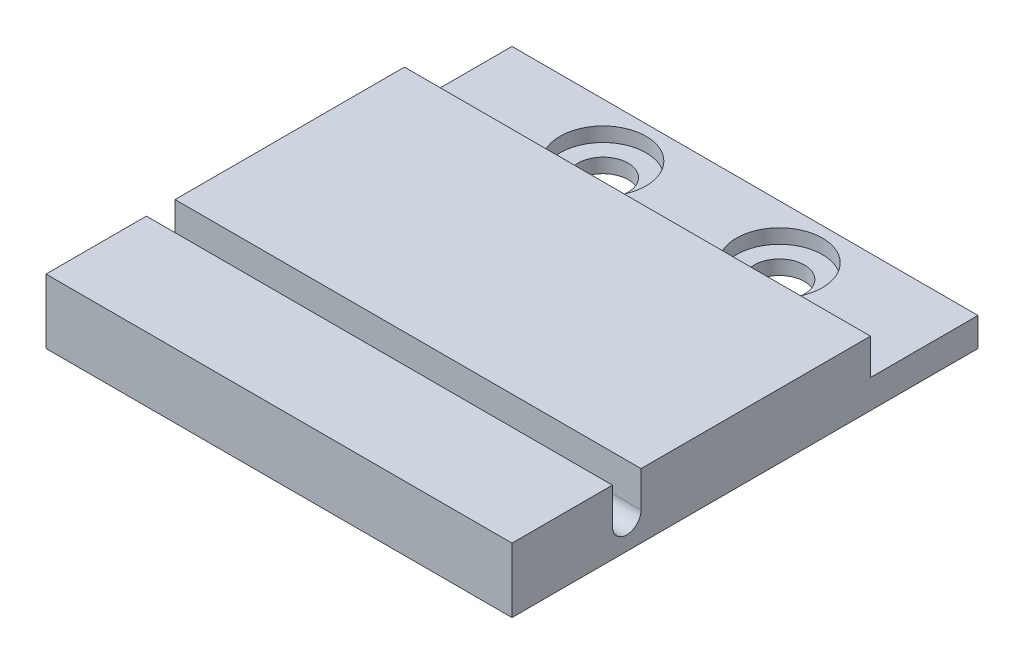
ISO-10303-21;
HEADER;
FILE_DESCRIPTION(('STEP AP214'),'2;1');
FILE_NAME('part.step','',(''),(''),'','','');
FILE_SCHEMA(('AUTOMOTIVE_DESIGN { 1 0 10303 214 1 1 1 1 }'));
ENDSEC;
DATA;
#1=APPLICATION_CONTEXT('core data for automotive mechanical design processes');
#2=APPLICATION_PROTOCOL_DEFINITION('international standard','automotive_design',2000,#1);
#3=PRODUCT_CONTEXT('',#1,'mechanical');
#4=PRODUCT('Part','Part','',(#3));
#5=PRODUCT_RELATED_PRODUCT_CATEGORY('part','',(#4));
#6=PRODUCT_DEFINITION_FORMATION('','',#4);
#7=PRODUCT_DEFINITION_CONTEXT('part definition',#1,'design');
#8=PRODUCT_DEFINITION('design','',#6,#7);
#9=PRODUCT_DEFINITION_SHAPE('','',#8);
#10=(LENGTH_UNIT() NAMED_UNIT(*) SI_UNIT(.MILLI.,.METRE.));
#11=(NAMED_UNIT(*) PLANE_ANGLE_UNIT() SI_UNIT($,.RADIAN.));
#12=(NAMED_UNIT(*) SI_UNIT($,.STERADIAN.) SOLID_ANGLE_UNIT());
#13=UNCERTAINTY_MEASURE_WITH_UNIT(LENGTH_MEASURE(1.E-05),#10,'distance_accuracy_value','');
#14=(GEOMETRIC_REPRESENTATION_CONTEXT(3) GLOBAL_UNCERTAINTY_ASSIGNED_CONTEXT((#13)) GLOBAL_UNIT_ASSIGNED_CONTEXT((#10,
#11,#12)) REPRESENTATION_CONTEXT('',''));
#15=CARTESIAN_POINT('',(0.,0.,0.));
#16=DIRECTION('',(0.,0.,1.));
#17=DIRECTION('',(1.,0.,0.));
#18=AXIS2_PLACEMENT_3D('',#15,#16,#17);
#19=CARTESIAN_POINT('',(0.,9.,0.));
#20=DIRECTION('',(0.,1.,0.));
#21=DIRECTION('',(0.,0.,1.));
#22=AXIS2_PLACEMENT_3D('',#19,#20,#21);
#23=PLANE('',#22);
#24=DIRECTION('',(1.,0.,0.));
#25=VECTOR('',#24,1.);
#26=CARTESIAN_POINT('',(-32.5,9.,18.5));
#27=LINE('',#26,#25);
#28=CARTESIAN_POINT('',(-32.5,9.,18.5));
#29=VERTEX_POINT('',#28);
#30=CARTESIAN_POINT('',(32.5,9.,18.5));
#31=VERTEX_POINT('',#30);
#32=EDGE_CURVE('E142',#29,#31,#27,.T.);
#33=ORIENTED_EDGE('',*,*,#32,.F.);
#34=DIRECTION('',(0.,0.,1.));
#35=VECTOR('',#34,1.);
#36=CARTESIAN_POINT('',(-32.5,9.,-17.5));
#37=LINE('',#36,#35);
#38=CARTESIAN_POINT('',(-32.5,9.,32.5));
#39=VERTEX_POINT('',#38);
#40=EDGE_CURVE('E150',#29,#39,#37,.T.);
#41=ORIENTED_EDGE('',*,*,#40,.T.);
#42=DIRECTION('',(1.,0.,0.));
#43=VECTOR('',#42,1.);
#44=CARTESIAN_POINT('',(-32.5,9.,32.5));
#45=LINE('',#44,#43);
#46=CARTESIAN_POINT('',(32.5,9.,32.5));
#47=VERTEX_POINT('',#46);
#48=EDGE_CURVE('E149',#39,#47,#45,.T.);
#49=ORIENTED_EDGE('',*,*,#48,.T.);
#50=DIRECTION('',(0.,0.,-1.));
#51=VECTOR('',#50,1.);
#52=CARTESIAN_POINT('',(32.5,9.,-17.5));
#53=LINE('',#52,#51);
#54=EDGE_CURVE('E153',#47,#31,#53,.T.);
#55=ORIENTED_EDGE('',*,*,#54,.T.);
#56=EDGE_LOOP('',(#33,#41,#49,#55));
#57=FACE_BOUND('',#56,.T.);
#58=ADVANCED_FACE('F35',(#57),#23,.T.);
#59=CARTESIAN_POINT('',(12.3,0.,-25.));
#60=DIRECTION('',(0.,1.,0.));
#61=DIRECTION('',(0.,0.,1.));
#62=AXIS2_PLACEMENT_3D('',#59,#60,#61);
#63=CYLINDRICAL_SURFACE('',#62,3.5);
#64=CARTESIAN_POINT('',(12.3,0.,-25.));
#65=DIRECTION('',(0.,1.,0.));
#66=DIRECTION('',(0.,0.,1.));
#67=AXIS2_PLACEMENT_3D('',#64,#65,#66);
#68=CIRCLE('',#67,3.5);
#69=CARTESIAN_POINT('',(12.3,0.,-21.5));
#70=VERTEX_POINT('',#69);
#71=EDGE_CURVE('E182',#70,#70,#68,.T.);
#72=ORIENTED_EDGE('',*,*,#71,.F.);
#73=EDGE_LOOP('',(#72));
#74=FACE_BOUND('',#73,.T.);
#75=CARTESIAN_POINT('',(12.3,2.,-25.));
#76=DIRECTION('',(0.,1.,0.));
#77=DIRECTION('',(0.,0.,1.));
#78=AXIS2_PLACEMENT_3D('',#75,#76,#77);
#79=CIRCLE('',#78,3.5);
#80=CARTESIAN_POINT('',(12.3,2.,-21.5));
#81=VERTEX_POINT('',#80);
#82=EDGE_CURVE('E39',#81,#81,#79,.F.);
#83=ORIENTED_EDGE('',*,*,#82,.F.);
#84=EDGE_LOOP('',(#83));
#85=FACE_BOUND('',#84,.T.);
#86=ADVANCED_FACE('F214',(#74,#85),#63,.F.);
#87=CARTESIAN_POINT('',(-12.3,0.,-25.));
#88=DIRECTION('',(0.,1.,0.));
#89=DIRECTION('',(0.,0.,1.));
#90=AXIS2_PLACEMENT_3D('',#87,#88,#89);
#91=CYLINDRICAL_SURFACE('',#90,3.5);
#92=CARTESIAN_POINT('',(-12.3,0.,-25.));
#93=DIRECTION('',(0.,1.,0.));
#94=DIRECTION('',(0.,0.,1.));
#95=AXIS2_PLACEMENT_3D('',#92,#93,#94);
#96=CIRCLE('',#95,3.5);
#97=CARTESIAN_POINT('',(-12.3,0.,-21.5));
#98=VERTEX_POINT('',#97);
#99=EDGE_CURVE('E178',#98,#98,#96,.T.);
#100=ORIENTED_EDGE('',*,*,#99,.F.);
#101=EDGE_LOOP('',(#100));
#102=FACE_BOUND('',#101,.T.);
#103=CARTESIAN_POINT('',(-12.3,2.,-25.));
#104=DIRECTION('',(0.,1.,0.));
#105=DIRECTION('',(0.,0.,1.));
#106=AXIS2_PLACEMENT_3D('',#103,#104,#105);
#107=CIRCLE('',#106,3.5);
#108=CARTESIAN_POINT('',(-12.3,2.,-21.5));
#109=VERTEX_POINT('',#108);
#110=EDGE_CURVE('E169',#109,#109,#107,.F.);
#111=ORIENTED_EDGE('',*,*,#110,.F.);
#112=EDGE_LOOP('',(#111));
#113=FACE_BOUND('',#112,.T.);
#114=ADVANCED_FACE('F216',(#102,#113),#91,.F.);
#115=CARTESIAN_POINT('',(32.5,4.,-32.5));
#116=DIRECTION('',(-1.,0.,0.));
#117=DIRECTION('',(0.,0.,1.));
#118=AXIS2_PLACEMENT_3D('',#115,#116,#117);
#119=PLANE('',#118);
#120=DIRECTION('',(0.,1.,0.));
#121=VECTOR('',#120,1.);
#122=CARTESIAN_POINT('',(32.5,9.,14.5));
#123=LINE('',#122,#121);
#124=CARTESIAN_POINT('',(32.5,4.,14.5));
#125=VERTEX_POINT('',#124);
#126=CARTESIAN_POINT('',(32.5,9.,14.5));
#127=VERTEX_POINT('',#126);
#128=EDGE_CURVE('E52',#125,#127,#123,.T.);
#129=ORIENTED_EDGE('',*,*,#128,.F.);
#130=CARTESIAN_POINT('',(32.5,4.,16.5));
#131=DIRECTION('',(1.,0.,0.));
#132=DIRECTION('',(0.,0.,-1.));
#133=AXIS2_PLACEMENT_3D('',#130,#131,#132);
#134=CIRCLE('',#133,2.);
#135=CARTESIAN_POINT('',(32.5,4.,18.5));
#136=VERTEX_POINT('',#135);
#137=EDGE_CURVE('E114',#136,#125,#134,.T.);
#138=ORIENTED_EDGE('',*,*,#137,.F.);
#139=DIRECTION('',(0.,-1.,0.));
#140=VECTOR('',#139,1.);
#141=CARTESIAN_POINT('',(32.5,9.,18.5));
#142=LINE('',#141,#140);
#143=EDGE_CURVE('E135',#31,#136,#142,.T.);
#144=ORIENTED_EDGE('',*,*,#143,.F.);
#145=ORIENTED_EDGE('',*,*,#54,.F.);
#146=DIRECTION('',(0.,-1.,0.));
#147=VECTOR('',#146,1.);
#148=CARTESIAN_POINT('',(32.5,4.,32.5));
#149=LINE('',#148,#147);
#150=CARTESIAN_POINT('',(32.5,0.,32.5));
#151=VERTEX_POINT('',#150);
#152=EDGE_CURVE('E192',#47,#151,#149,.T.);
#153=ORIENTED_EDGE('',*,*,#152,.T.);
#154=DIRECTION('',(0.,0.,-1.));
#155=VECTOR('',#154,1.);
#156=CARTESIAN_POINT('',(32.5,0.,-32.5));
#157=LINE('',#156,#155);
#158=CARTESIAN_POINT('',(32.5,0.,-32.5));
#159=VERTEX_POINT('',#158);
#160=EDGE_CURVE('E181',#151,#159,#157,.T.);
#161=ORIENTED_EDGE('',*,*,#160,.T.);
#162=DIRECTION('',(0.,-1.,0.));
#163=VECTOR('',#162,1.);
#164=CARTESIAN_POINT('',(32.5,4.,-32.5));
#165=LINE('',#164,#163);
#166=CARTESIAN_POINT('',(32.5,4.,-32.5));
#167=VERTEX_POINT('',#166);
#168=EDGE_CURVE('E11',#167,#159,#165,.T.);
#169=ORIENTED_EDGE('',*,*,#168,.F.);
#170=DIRECTION('',(0.,0.,-1.));
#171=VECTOR('',#170,1.);
#172=CARTESIAN_POINT('',(32.5,4.,-32.5));
#173=LINE('',#172,#171);
#174=CARTESIAN_POINT('',(32.5,4.,-17.5));
#175=VERTEX_POINT('',#174);
#176=EDGE_CURVE('E185',#175,#167,#173,.T.);
#177=ORIENTED_EDGE('',*,*,#176,.F.);
#178=DIRECTION('',(0.,-1.,0.));
#179=VECTOR('',#178,1.);
#180=CARTESIAN_POINT('',(32.5,9.,-17.5));
#181=LINE('',#180,#179);
#182=CARTESIAN_POINT('',(32.5,9.,-17.5));
#183=VERTEX_POINT('',#182);
#184=EDGE_CURVE('E162',#183,#175,#181,.T.);
#185=ORIENTED_EDGE('',*,*,#184,.F.);
#186=EDGE_CURVE('E133',#127,#183,#53,.T.);
#187=ORIENTED_EDGE('',*,*,#186,.F.);
#188=EDGE_LOOP('',(#129,#138,#144,#145,#153,#161,#169,#177,#185,#187));
#189=FACE_BOUND('',#188,.T.);
#190=ADVANCED_FACE('F37',(#189),#119,.F.);
#191=CARTESIAN_POINT('',(-32.5,4.,-32.5));
#192=DIRECTION('',(0.,0.,1.));
#193=DIRECTION('',(1.,0.,0.));
#194=AXIS2_PLACEMENT_3D('',#191,#192,#193);
#195=PLANE('',#194);
#196=DIRECTION('',(-1.,0.,0.));
#197=VECTOR('',#196,1.);
#198=CARTESIAN_POINT('',(-32.5,0.,-32.5));
#199=LINE('',#198,#197);
#200=CARTESIAN_POINT('',(-32.5,0.,-32.5));
#201=VERTEX_POINT('',#200);
#202=EDGE_CURVE('E195',#159,#201,#199,.T.);
#203=ORIENTED_EDGE('',*,*,#202,.T.);
#204=DIRECTION('',(0.,-1.,0.));
#205=VECTOR('',#204,1.);
#206=CARTESIAN_POINT('',(-32.5,4.,-32.5));
#207=LINE('',#206,#205);
#208=CARTESIAN_POINT('',(-32.5,4.,-32.5));
#209=VERTEX_POINT('',#208);
#210=EDGE_CURVE('E44',#209,#201,#207,.T.);
#211=ORIENTED_EDGE('',*,*,#210,.F.);
#212=DIRECTION('',(-1.,0.,0.));
#213=VECTOR('',#212,1.);
#214=CARTESIAN_POINT('',(-32.5,4.,-32.5));
#215=LINE('',#214,#213);
#216=EDGE_CURVE('E187',#167,#209,#215,.T.);
#217=ORIENTED_EDGE('',*,*,#216,.F.);
#218=ORIENTED_EDGE('',*,*,#168,.T.);
#219=EDGE_LOOP('',(#203,#211,#217,#218));
#220=FACE_BOUND('',#219,.T.);
#221=ADVANCED_FACE('F245',(#220),#195,.F.);
#222=CARTESIAN_POINT('',(-32.5,4.,-32.5));
#223=DIRECTION('',(1.,0.,0.));
#224=DIRECTION('',(0.,0.,-1.));
#225=AXIS2_PLACEMENT_3D('',#222,#223,#224);
#226=PLANE('',#225);
#227=DIRECTION('',(0.,-1.,0.));
#228=VECTOR('',#227,1.);
#229=CARTESIAN_POINT('',(-32.5,9.,18.5));
#230=LINE('',#229,#228);
#231=CARTESIAN_POINT('',(-32.5,4.,18.5));
#232=VERTEX_POINT('',#231);
#233=EDGE_CURVE('E134',#29,#232,#230,.T.);
#234=ORIENTED_EDGE('',*,*,#233,.T.);
#235=CARTESIAN_POINT('',(-32.5,4.,16.5));
#236=DIRECTION('',(1.,0.,0.));
#237=DIRECTION('',(0.,0.,-1.));
#238=AXIS2_PLACEMENT_3D('',#235,#236,#237);
#239=CIRCLE('',#238,2.);
#240=CARTESIAN_POINT('',(-32.5,4.,14.5));
#241=VERTEX_POINT('',#240);
#242=EDGE_CURVE('E123',#232,#241,#239,.T.);
#243=ORIENTED_EDGE('',*,*,#242,.T.);
#244=DIRECTION('',(0.,1.,0.));
#245=VECTOR('',#244,1.);
#246=CARTESIAN_POINT('',(-32.5,9.,14.5));
#247=LINE('',#246,#245);
#248=CARTESIAN_POINT('',(-32.5,9.,14.5));
#249=VERTEX_POINT('',#248);
#250=EDGE_CURVE('E128',#241,#249,#247,.T.);
#251=ORIENTED_EDGE('',*,*,#250,.T.);
#252=CARTESIAN_POINT('',(-32.5,9.,-17.5));
#253=VERTEX_POINT('',#252);
#254=EDGE_CURVE('E146',#253,#249,#37,.T.);
#255=ORIENTED_EDGE('',*,*,#254,.F.);
#256=DIRECTION('',(0.,-1.,0.));
#257=VECTOR('',#256,1.);
#258=CARTESIAN_POINT('',(-32.5,9.,-17.5));
#259=LINE('',#258,#257);
#260=CARTESIAN_POINT('',(-32.5,4.,-17.5));
#261=VERTEX_POINT('',#260);
#262=EDGE_CURVE('E158',#253,#261,#259,.T.);
#263=ORIENTED_EDGE('',*,*,#262,.T.);
#264=DIRECTION('',(0.,0.,1.));
#265=VECTOR('',#264,1.);
#266=CARTESIAN_POINT('',(-32.5,4.,-32.5));
#267=LINE('',#266,#265);
#268=EDGE_CURVE('E190',#209,#261,#267,.T.);
#269=ORIENTED_EDGE('',*,*,#268,.F.);
#270=ORIENTED_EDGE('',*,*,#210,.T.);
#271=DIRECTION('',(0.,0.,1.));
#272=VECTOR('',#271,1.);
#273=CARTESIAN_POINT('',(-32.5,0.,-32.5));
#274=LINE('',#273,#272);
#275=CARTESIAN_POINT('',(-32.5,0.,32.5));
#276=VERTEX_POINT('',#275);
#277=EDGE_CURVE('E197',#201,#276,#274,.T.);
#278=ORIENTED_EDGE('',*,*,#277,.T.);
#279=DIRECTION('',(0.,-1.,0.));
#280=VECTOR('',#279,1.);
#281=CARTESIAN_POINT('',(-32.5,4.,32.5));
#282=LINE('',#281,#280);
#283=EDGE_CURVE('E202',#39,#276,#282,.T.);
#284=ORIENTED_EDGE('',*,*,#283,.F.);
#285=ORIENTED_EDGE('',*,*,#40,.F.);
#286=EDGE_LOOP('',(#234,#243,#251,#255,#263,#269,#270,#278,#284,#285));
#287=FACE_BOUND('',#286,.T.);
#288=ADVANCED_FACE('F242',(#287),#226,.F.);
#289=CARTESIAN_POINT('',(-32.5,4.,32.5));
#290=DIRECTION('',(0.,0.,-1.));
#291=DIRECTION('',(-1.,0.,0.));
#292=AXIS2_PLACEMENT_3D('',#289,#290,#291);
#293=PLANE('',#292);
#294=DIRECTION('',(1.,0.,0.));
#295=VECTOR('',#294,1.);
#296=CARTESIAN_POINT('',(-32.5,0.,32.5));
#297=LINE('',#296,#295);
#298=EDGE_CURVE('E188',#276,#151,#297,.T.);
#299=ORIENTED_EDGE('',*,*,#298,.T.);
#300=ORIENTED_EDGE('',*,*,#152,.F.);
#301=ORIENTED_EDGE('',*,*,#48,.F.);
#302=ORIENTED_EDGE('',*,*,#283,.T.);
#303=EDGE_LOOP('',(#299,#300,#301,#302));
#304=FACE_BOUND('',#303,.T.);
#305=ADVANCED_FACE('F235',(#304),#293,.F.);
#306=CARTESIAN_POINT('',(0.,4.,0.));
#307=DIRECTION('',(0.,1.,0.));
#308=DIRECTION('',(0.,0.,1.));
#309=AXIS2_PLACEMENT_3D('',#306,#307,#308);
#310=PLANE('',#309);
#311=DIRECTION('',(-1.,0.,0.));
#312=VECTOR('',#311,1.);
#313=CARTESIAN_POINT('',(-32.5,4.,-17.5));
#314=LINE('',#313,#312);
#315=EDGE_CURVE('E60',#175,#261,#314,.T.);
#316=ORIENTED_EDGE('',*,*,#315,.F.);
#317=ORIENTED_EDGE('',*,*,#176,.T.);
#318=ORIENTED_EDGE('',*,*,#216,.T.);
#319=ORIENTED_EDGE('',*,*,#268,.T.);
#320=EDGE_LOOP('',(#316,#317,#318,#319));
#321=FACE_BOUND('',#320,.T.);
#322=CARTESIAN_POINT('',(-12.3,4.,-25.));
#323=DIRECTION('',(0.,1.,0.));
#324=DIRECTION('',(0.,0.,1.));
#325=AXIS2_PLACEMENT_3D('',#322,#323,#324);
#326=CIRCLE('',#325,6.);
#327=CARTESIAN_POINT('',(-12.3,4.,-19.));
#328=VERTEX_POINT('',#327);
#329=EDGE_CURVE('E170',#328,#328,#326,.T.);
#330=ORIENTED_EDGE('',*,*,#329,.F.);
#331=EDGE_LOOP('',(#330));
#332=FACE_BOUND('',#331,.T.);
#333=CARTESIAN_POINT('',(12.3,4.,-25.));
#334=DIRECTION('',(0.,1.,0.));
#335=DIRECTION('',(0.,0.,1.));
#336=AXIS2_PLACEMENT_3D('',#333,#334,#335);
#337=CIRCLE('',#336,6.);
#338=CARTESIAN_POINT('',(12.3,4.,-19.));
#339=VERTEX_POINT('',#338);
#340=EDGE_CURVE('E165',#339,#339,#337,.T.);
#341=ORIENTED_EDGE('',*,*,#340,.F.);
#342=EDGE_LOOP('',(#341));
#343=FACE_BOUND('',#342,.T.);
#344=ADVANCED_FACE('F231',(#321,#332,#343),#310,.T.);
#345=CARTESIAN_POINT('',(0.,0.,0.));
#346=DIRECTION('',(0.,1.,0.));
#347=DIRECTION('',(0.,0.,1.));
#348=AXIS2_PLACEMENT_3D('',#345,#346,#347);
#349=PLANE('',#348);
#350=ORIENTED_EDGE('',*,*,#99,.T.);
#351=EDGE_LOOP('',(#350));
#352=FACE_BOUND('',#351,.T.);
#353=ORIENTED_EDGE('',*,*,#71,.T.);
#354=EDGE_LOOP('',(#353));
#355=FACE_BOUND('',#354,.T.);
#356=ORIENTED_EDGE('',*,*,#160,.F.);
#357=ORIENTED_EDGE('',*,*,#298,.F.);
#358=ORIENTED_EDGE('',*,*,#277,.F.);
#359=ORIENTED_EDGE('',*,*,#202,.F.);
#360=EDGE_LOOP('',(#356,#357,#358,#359));
#361=FACE_BOUND('',#360,.T.);
#362=ADVANCED_FACE('F234',(#352,#355,#361),#349,.F.);
#363=CARTESIAN_POINT('',(-12.3,2.,-25.));
#364=DIRECTION('',(0.,1.,0.));
#365=DIRECTION('',(0.,0.,1.));
#366=AXIS2_PLACEMENT_3D('',#363,#364,#365);
#367=PLANE('',#366);
#368=CARTESIAN_POINT('',(-12.3,2.,-25.));
#369=DIRECTION('',(0.,1.,0.));
#370=DIRECTION('',(0.,0.,1.));
#371=AXIS2_PLACEMENT_3D('',#368,#369,#370);
#372=CIRCLE('',#371,6.);
#373=CARTESIAN_POINT('',(-12.3,2.,-19.));
#374=VERTEX_POINT('',#373);
#375=EDGE_CURVE('E166',#374,#374,#372,.T.);
#376=ORIENTED_EDGE('',*,*,#375,.T.);
#377=EDGE_LOOP('',(#376));
#378=FACE_BOUND('',#377,.T.);
#379=ORIENTED_EDGE('',*,*,#110,.T.);
#380=EDGE_LOOP('',(#379));
#381=FACE_BOUND('',#380,.T.);
#382=ADVANCED_FACE('F238',(#378,#381),#367,.T.);
#383=CARTESIAN_POINT('',(-12.3,2.,-25.));
#384=DIRECTION('',(0.,1.,0.));
#385=DIRECTION('',(0.,0.,1.));
#386=AXIS2_PLACEMENT_3D('',#383,#384,#385);
#387=CYLINDRICAL_SURFACE('',#386,6.);
#388=ORIENTED_EDGE('',*,*,#375,.F.);
#389=EDGE_LOOP('',(#388));
#390=FACE_BOUND('',#389,.T.);
#391=ORIENTED_EDGE('',*,*,#329,.T.);
#392=EDGE_LOOP('',(#391));
#393=FACE_BOUND('',#392,.T.);
#394=ADVANCED_FACE('F284',(#390,#393),#387,.F.);
#395=CARTESIAN_POINT('',(12.3,2.,-25.));
#396=DIRECTION('',(0.,1.,0.));
#397=DIRECTION('',(0.,0.,1.));
#398=AXIS2_PLACEMENT_3D('',#395,#396,#397);
#399=PLANE('',#398);
#400=CARTESIAN_POINT('',(12.3,2.,-25.));
#401=DIRECTION('',(0.,1.,0.));
#402=DIRECTION('',(0.,0.,1.));
#403=AXIS2_PLACEMENT_3D('',#400,#401,#402);
#404=CIRCLE('',#403,6.);
#405=CARTESIAN_POINT('',(12.3,2.,-19.));
#406=VERTEX_POINT('',#405);
#407=EDGE_CURVE('E173',#406,#406,#404,.T.);
#408=ORIENTED_EDGE('',*,*,#407,.T.);
#409=EDGE_LOOP('',(#408));
#410=FACE_BOUND('',#409,.T.);
#411=ORIENTED_EDGE('',*,*,#82,.T.);
#412=EDGE_LOOP('',(#411));
#413=FACE_BOUND('',#412,.T.);
#414=ADVANCED_FACE('F212',(#410,#413),#399,.T.);
#415=CARTESIAN_POINT('',(12.3,2.,-25.));
#416=DIRECTION('',(0.,1.,0.));
#417=DIRECTION('',(0.,0.,1.));
#418=AXIS2_PLACEMENT_3D('',#415,#416,#417);
#419=CYLINDRICAL_SURFACE('',#418,6.);
#420=ORIENTED_EDGE('',*,*,#407,.F.);
#421=EDGE_LOOP('',(#420));
#422=FACE_BOUND('',#421,.T.);
#423=ORIENTED_EDGE('',*,*,#340,.T.);
#424=EDGE_LOOP('',(#423));
#425=FACE_BOUND('',#424,.T.);
#426=ADVANCED_FACE('F280',(#422,#425),#419,.F.);
#427=CARTESIAN_POINT('',(-32.5,9.,-17.5));
#428=DIRECTION('',(0.,0.,1.));
#429=DIRECTION('',(1.,0.,0.));
#430=AXIS2_PLACEMENT_3D('',#427,#428,#429);
#431=PLANE('',#430);
#432=ORIENTED_EDGE('',*,*,#315,.T.);
#433=ORIENTED_EDGE('',*,*,#262,.F.);
#434=DIRECTION('',(-1.,0.,0.));
#435=VECTOR('',#434,1.);
#436=CARTESIAN_POINT('',(-32.5,9.,-17.5));
#437=LINE('',#436,#435);
#438=EDGE_CURVE('E156',#183,#253,#437,.T.);
#439=ORIENTED_EDGE('',*,*,#438,.F.);
#440=ORIENTED_EDGE('',*,*,#184,.T.);
#441=EDGE_LOOP('',(#432,#433,#439,#440));
#442=FACE_BOUND('',#441,.T.);
#443=ADVANCED_FACE('F274',(#442),#431,.F.);
#444=DIRECTION('',(1.,0.,0.));
#445=VECTOR('',#444,1.);
#446=CARTESIAN_POINT('',(-32.5,9.,14.5));
#447=LINE('',#446,#445);
#448=EDGE_CURVE('E129',#249,#127,#447,.T.);
#449=ORIENTED_EDGE('',*,*,#448,.T.);
#450=ORIENTED_EDGE('',*,*,#186,.T.);
#451=ORIENTED_EDGE('',*,*,#438,.T.);
#452=ORIENTED_EDGE('',*,*,#254,.T.);
#453=EDGE_LOOP('',(#449,#450,#451,#452));
#454=FACE_BOUND('',#453,.T.);
#455=ADVANCED_FACE('F227',(#454),#23,.T.);
#456=CARTESIAN_POINT('',(-32.5,9.,18.5));
#457=DIRECTION('',(0.,0.,1.));
#458=DIRECTION('',(1.,0.,0.));
#459=AXIS2_PLACEMENT_3D('',#456,#457,#458);
#460=PLANE('',#459);
#461=ORIENTED_EDGE('',*,*,#143,.T.);
#462=DIRECTION('',(1.,0.,0.));
#463=VECTOR('',#462,1.);
#464=CARTESIAN_POINT('',(-32.5,4.,18.5));
#465=LINE('',#464,#463);
#466=EDGE_CURVE('E119',#232,#136,#465,.T.);
#467=ORIENTED_EDGE('',*,*,#466,.F.);
#468=ORIENTED_EDGE('',*,*,#233,.F.);
#469=ORIENTED_EDGE('',*,*,#32,.T.);
#470=EDGE_LOOP('',(#461,#467,#468,#469));
#471=FACE_BOUND('',#470,.T.);
#472=ADVANCED_FACE('F266',(#471),#460,.F.);
#473=CARTESIAN_POINT('',(-32.5,9.,14.5));
#474=DIRECTION('',(0.,0.,-1.));
#475=DIRECTION('',(-1.,0.,0.));
#476=AXIS2_PLACEMENT_3D('',#473,#474,#475);
#477=PLANE('',#476);
#478=ORIENTED_EDGE('',*,*,#128,.T.);
#479=ORIENTED_EDGE('',*,*,#448,.F.);
#480=ORIENTED_EDGE('',*,*,#250,.F.);
#481=DIRECTION('',(1.,0.,0.));
#482=VECTOR('',#481,1.);
#483=CARTESIAN_POINT('',(-32.5,4.,14.5));
#484=LINE('',#483,#482);
#485=EDGE_CURVE('E116',#241,#125,#484,.T.);
#486=ORIENTED_EDGE('',*,*,#485,.T.);
#487=EDGE_LOOP('',(#478,#479,#480,#486));
#488=FACE_BOUND('',#487,.T.);
#489=ADVANCED_FACE('F126',(#488),#477,.F.);
#490=CARTESIAN_POINT('',(-32.5,4.,16.5));
#491=DIRECTION('',(1.,0.,0.));
#492=DIRECTION('',(0.,0.,-1.));
#493=AXIS2_PLACEMENT_3D('',#490,#491,#492);
#494=CYLINDRICAL_SURFACE('',#493,2.);
#495=ORIENTED_EDGE('',*,*,#242,.F.);
#496=ORIENTED_EDGE('',*,*,#466,.T.);
#497=ORIENTED_EDGE('',*,*,#137,.T.);
#498=ORIENTED_EDGE('',*,*,#485,.F.);
#499=EDGE_LOOP('',(#495,#496,#497,#498));
#500=FACE_BOUND('',#499,.T.);
#501=ADVANCED_FACE('F115',(#500),#494,.F.);
#502=CLOSED_SHELL('',(#58,#86,#114,#190,#221,#288,#305,#344,#362,#382,#394,#414,#426,#443,#455,
#472,#489,#501));
#503=MANIFOLD_SOLID_BREP('B2',#502);
#504=ADVANCED_BREP_SHAPE_REPRESENTATION('',(#18,#503),#14);
#505=SHAPE_DEFINITION_REPRESENTATION(#9,#504);
ENDSEC;
END-ISO-10303-21;
